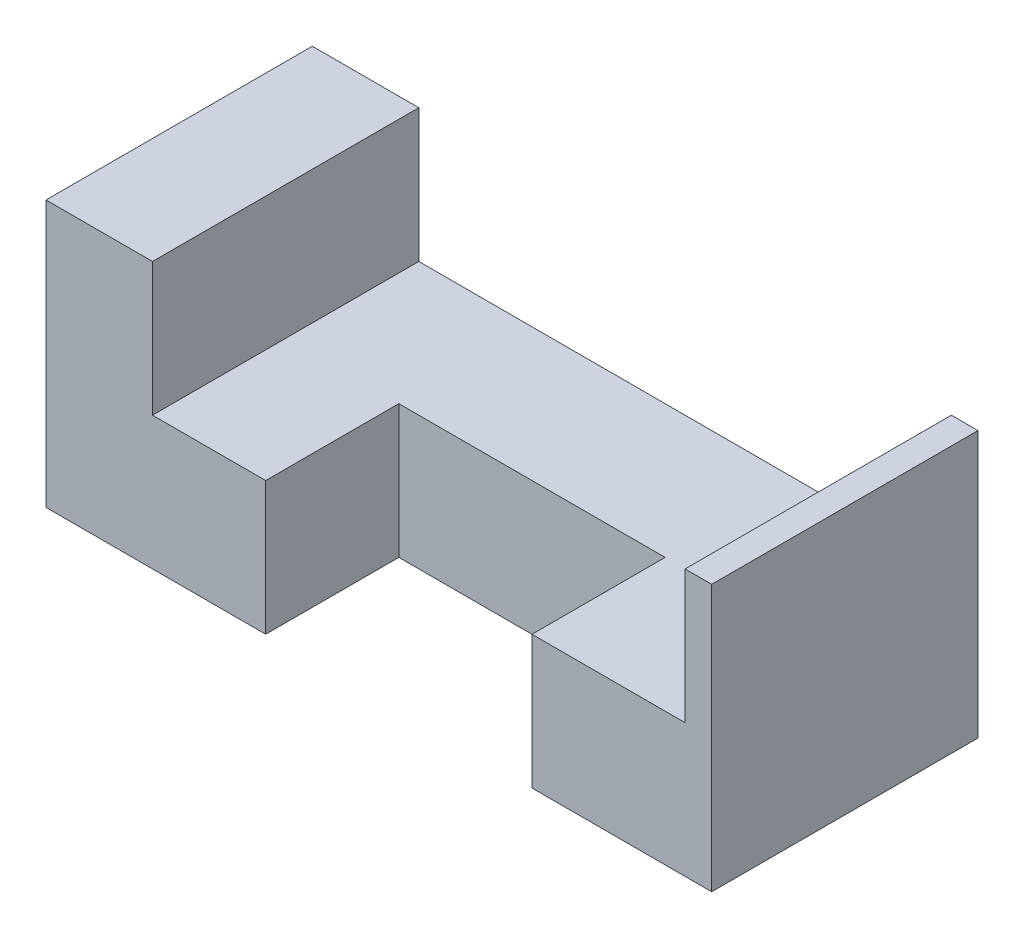
ISO-10303-21;
HEADER;
FILE_DESCRIPTION(('STEP AP214'),'2;1');
FILE_NAME('part.step','',(''),(''),'','','');
FILE_SCHEMA(('AUTOMOTIVE_DESIGN { 1 0 10303 214 1 1 1 1 }'));
ENDSEC;
DATA;
#1=APPLICATION_CONTEXT('core data for automotive mechanical design processes');
#2=APPLICATION_PROTOCOL_DEFINITION('international standard','automotive_design',2000,#1);
#3=PRODUCT_CONTEXT('',#1,'mechanical');
#4=PRODUCT('Part','Part','',(#3));
#5=PRODUCT_RELATED_PRODUCT_CATEGORY('part','',(#4));
#6=PRODUCT_DEFINITION_FORMATION('','',#4);
#7=PRODUCT_DEFINITION_CONTEXT('part definition',#1,'design');
#8=PRODUCT_DEFINITION('design','',#6,#7);
#9=PRODUCT_DEFINITION_SHAPE('','',#8);
#10=(LENGTH_UNIT() NAMED_UNIT(*) SI_UNIT(.MILLI.,.METRE.));
#11=(NAMED_UNIT(*) PLANE_ANGLE_UNIT() SI_UNIT($,.RADIAN.));
#12=(NAMED_UNIT(*) SI_UNIT($,.STERADIAN.) SOLID_ANGLE_UNIT());
#13=UNCERTAINTY_MEASURE_WITH_UNIT(LENGTH_MEASURE(1.E-05),#10,'distance_accuracy_value','');
#14=(GEOMETRIC_REPRESENTATION_CONTEXT(3) GLOBAL_UNCERTAINTY_ASSIGNED_CONTEXT((#13)) GLOBAL_UNIT_ASSIGNED_CONTEXT((#10,
#11,#12)) REPRESENTATION_CONTEXT('',''));
#15=CARTESIAN_POINT('',(0.,0.,0.));
#16=DIRECTION('',(0.,0.,1.));
#17=DIRECTION('',(1.,0.,0.));
#18=AXIS2_PLACEMENT_3D('',#15,#16,#17);
#19=CARTESIAN_POINT('',(0.,0.,20.));
#20=DIRECTION('',(0.,0.,1.));
#21=DIRECTION('',(1.,0.,0.));
#22=AXIS2_PLACEMENT_3D('',#19,#20,#21);
#23=PLANE('',#22);
#24=DIRECTION('',(0.,1.,0.));
#25=VECTOR('',#24,1.);
#26=CARTESIAN_POINT('',(11.5,-10.,20.));
#27=LINE('',#26,#25);
#28=CARTESIAN_POINT('',(11.5,-10.,20.));
#29=VERTEX_POINT('',#28);
#30=CARTESIAN_POINT('',(11.5,0.,20.));
#31=VERTEX_POINT('',#30);
#32=EDGE_CURVE('E164',#29,#31,#27,.T.);
#33=ORIENTED_EDGE('',*,*,#32,.F.);
#34=DIRECTION('',(1.,0.,0.));
#35=VECTOR('',#34,1.);
#36=CARTESIAN_POINT('',(0.,-10.,20.));
#37=LINE('',#36,#35);
#38=CARTESIAN_POINT('',(25.,-10.,20.));
#39=VERTEX_POINT('',#38);
#40=EDGE_CURVE('E132',#29,#39,#37,.T.);
#41=ORIENTED_EDGE('',*,*,#40,.T.);
#42=DIRECTION('',(0.,-1.,0.));
#43=VECTOR('',#42,1.);
#44=CARTESIAN_POINT('',(25.,0.,20.));
#45=LINE('',#44,#43);
#46=CARTESIAN_POINT('',(25.,10.,20.));
#47=VERTEX_POINT('',#46);
#48=EDGE_CURVE('E153',#47,#39,#45,.T.);
#49=ORIENTED_EDGE('',*,*,#48,.F.);
#50=DIRECTION('',(1.,0.,0.));
#51=VECTOR('',#50,1.);
#52=CARTESIAN_POINT('',(0.,10.,20.));
#53=LINE('',#52,#51);
#54=CARTESIAN_POINT('',(23.,10.,20.));
#55=VERTEX_POINT('',#54);
#56=EDGE_CURVE('E186',#55,#47,#53,.T.);
#57=ORIENTED_EDGE('',*,*,#56,.F.);
#58=DIRECTION('',(0.,-1.,0.));
#59=VECTOR('',#58,1.);
#60=CARTESIAN_POINT('',(23.,0.,20.));
#61=LINE('',#60,#59);
#62=CARTESIAN_POINT('',(23.,0.,20.));
#63=VERTEX_POINT('',#62);
#64=EDGE_CURVE('E226',#55,#63,#61,.T.);
#65=ORIENTED_EDGE('',*,*,#64,.T.);
#66=DIRECTION('',(1.,0.,0.));
#67=VECTOR('',#66,1.);
#68=CARTESIAN_POINT('',(0.,0.,20.));
#69=LINE('',#68,#67);
#70=EDGE_CURVE('E205',#31,#63,#69,.T.);
#71=ORIENTED_EDGE('',*,*,#70,.F.);
#72=EDGE_LOOP('',(#33,#41,#49,#57,#65,#71));
#73=FACE_BOUND('',#72,.T.);
#74=ADVANCED_FACE('F41',(#73),#23,.T.);
#75=CARTESIAN_POINT('',(0.,10.,20.));
#76=DIRECTION('',(0.,1.,0.));
#77=DIRECTION('',(0.,0.,1.));
#78=AXIS2_PLACEMENT_3D('',#75,#76,#77);
#79=PLANE('',#78);
#80=DIRECTION('',(1.,0.,0.));
#81=VECTOR('',#80,1.);
#82=CARTESIAN_POINT('',(0.,10.,0.));
#83=LINE('',#82,#81);
#84=CARTESIAN_POINT('',(23.,10.,0.));
#85=VERTEX_POINT('',#84);
#86=CARTESIAN_POINT('',(25.,10.,0.));
#87=VERTEX_POINT('',#86);
#88=EDGE_CURVE('E160',#85,#87,#83,.T.);
#89=ORIENTED_EDGE('',*,*,#88,.F.);
#90=DIRECTION('',(0.,0.,-1.));
#91=VECTOR('',#90,1.);
#92=CARTESIAN_POINT('',(23.,10.,20.));
#93=LINE('',#92,#91);
#94=EDGE_CURVE('E11',#55,#85,#93,.T.);
#95=ORIENTED_EDGE('',*,*,#94,.F.);
#96=ORIENTED_EDGE('',*,*,#56,.T.);
#97=DIRECTION('',(0.,0.,-1.));
#98=VECTOR('',#97,1.);
#99=CARTESIAN_POINT('',(25.,10.,20.));
#100=LINE('',#99,#98);
#101=EDGE_CURVE('E66',#47,#87,#100,.T.);
#102=ORIENTED_EDGE('',*,*,#101,.T.);
#103=EDGE_LOOP('',(#89,#95,#96,#102));
#104=FACE_BOUND('',#103,.T.);
#105=ADVANCED_FACE('F295',(#104),#79,.T.);
#106=CARTESIAN_POINT('',(23.,0.,20.));
#107=DIRECTION('',(1.,0.,0.));
#108=DIRECTION('',(0.,0.,-1.));
#109=AXIS2_PLACEMENT_3D('',#106,#107,#108);
#110=PLANE('',#109);
#111=DIRECTION('',(0.,-1.,0.));
#112=VECTOR('',#111,1.);
#113=CARTESIAN_POINT('',(23.,0.,0.));
#114=LINE('',#113,#112);
#115=CARTESIAN_POINT('',(23.,0.,0.));
#116=VERTEX_POINT('',#115);
#117=EDGE_CURVE('E163',#85,#116,#114,.T.);
#118=ORIENTED_EDGE('',*,*,#117,.T.);
#119=DIRECTION('',(0.,0.,-1.));
#120=VECTOR('',#119,1.);
#121=CARTESIAN_POINT('',(23.,0.,20.));
#122=LINE('',#121,#120);
#123=EDGE_CURVE('E50',#63,#116,#122,.T.);
#124=ORIENTED_EDGE('',*,*,#123,.F.);
#125=ORIENTED_EDGE('',*,*,#64,.F.);
#126=ORIENTED_EDGE('',*,*,#94,.T.);
#127=EDGE_LOOP('',(#118,#124,#125,#126));
#128=FACE_BOUND('',#127,.T.);
#129=ADVANCED_FACE('F43',(#128),#110,.F.);
#130=CARTESIAN_POINT('',(0.,0.,20.));
#131=DIRECTION('',(0.,1.,0.));
#132=DIRECTION('',(0.,0.,1.));
#133=AXIS2_PLACEMENT_3D('',#130,#131,#132);
#134=PLANE('',#133);
#135=DIRECTION('',(0.,0.,-1.));
#136=VECTOR('',#135,1.);
#137=CARTESIAN_POINT('',(11.5,0.,20.));
#138=LINE('',#137,#136);
#139=CARTESIAN_POINT('',(11.5,0.,10.));
#140=VERTEX_POINT('',#139);
#141=EDGE_CURVE('E251',#31,#140,#138,.T.);
#142=ORIENTED_EDGE('',*,*,#141,.F.);
#143=ORIENTED_EDGE('',*,*,#70,.T.);
#144=ORIENTED_EDGE('',*,*,#123,.T.);
#145=DIRECTION('',(1.,0.,0.));
#146=VECTOR('',#145,1.);
#147=CARTESIAN_POINT('',(0.,0.,0.));
#148=LINE('',#147,#146);
#149=CARTESIAN_POINT('',(-17.,0.,0.));
#150=VERTEX_POINT('',#149);
#151=EDGE_CURVE('E169',#150,#116,#148,.T.);
#152=ORIENTED_EDGE('',*,*,#151,.F.);
#153=DIRECTION('',(0.,0.,-1.));
#154=VECTOR('',#153,1.);
#155=CARTESIAN_POINT('',(-17.,0.,20.));
#156=LINE('',#155,#154);
#157=CARTESIAN_POINT('',(-17.,0.,20.));
#158=VERTEX_POINT('',#157);
#159=EDGE_CURVE('E196',#158,#150,#156,.T.);
#160=ORIENTED_EDGE('',*,*,#159,.F.);
#161=CARTESIAN_POINT('',(-8.5,0.,20.));
#162=VERTEX_POINT('',#161);
#163=EDGE_CURVE('E220',#158,#162,#69,.T.);
#164=ORIENTED_EDGE('',*,*,#163,.T.);
#165=DIRECTION('',(0.,0.,1.));
#166=VECTOR('',#165,1.);
#167=CARTESIAN_POINT('',(-8.5,0.,20.));
#168=LINE('',#167,#166);
#169=CARTESIAN_POINT('',(-8.5,0.,10.));
#170=VERTEX_POINT('',#169);
#171=EDGE_CURVE('E57',#170,#162,#168,.T.);
#172=ORIENTED_EDGE('',*,*,#171,.F.);
#173=DIRECTION('',(-1.,0.,0.));
#174=VECTOR('',#173,1.);
#175=CARTESIAN_POINT('',(11.5,0.,10.));
#176=LINE('',#175,#174);
#177=EDGE_CURVE('E247',#140,#170,#176,.T.);
#178=ORIENTED_EDGE('',*,*,#177,.F.);
#179=EDGE_LOOP('',(#142,#143,#144,#152,#160,#164,#172,#178));
#180=FACE_BOUND('',#179,.T.);
#181=ADVANCED_FACE('F203',(#180),#134,.T.);
#182=CARTESIAN_POINT('',(-17.,0.,20.));
#183=DIRECTION('',(1.,0.,0.));
#184=DIRECTION('',(0.,0.,-1.));
#185=AXIS2_PLACEMENT_3D('',#182,#183,#184);
#186=PLANE('',#185);
#187=DIRECTION('',(0.,-1.,0.));
#188=VECTOR('',#187,1.);
#189=CARTESIAN_POINT('',(-17.,0.,0.));
#190=LINE('',#189,#188);
#191=CARTESIAN_POINT('',(-17.,10.,0.));
#192=VERTEX_POINT('',#191);
#193=EDGE_CURVE('E173',#192,#150,#190,.T.);
#194=ORIENTED_EDGE('',*,*,#193,.F.);
#195=DIRECTION('',(0.,0.,-1.));
#196=VECTOR('',#195,1.);
#197=CARTESIAN_POINT('',(-17.,10.,20.));
#198=LINE('',#197,#196);
#199=CARTESIAN_POINT('',(-17.,10.,20.));
#200=VERTEX_POINT('',#199);
#201=EDGE_CURVE('E193',#200,#192,#198,.T.);
#202=ORIENTED_EDGE('',*,*,#201,.F.);
#203=DIRECTION('',(0.,-1.,0.));
#204=VECTOR('',#203,1.);
#205=CARTESIAN_POINT('',(-17.,0.,20.));
#206=LINE('',#205,#204);
#207=EDGE_CURVE('E217',#200,#158,#206,.T.);
#208=ORIENTED_EDGE('',*,*,#207,.T.);
#209=ORIENTED_EDGE('',*,*,#159,.T.);
#210=EDGE_LOOP('',(#194,#202,#208,#209));
#211=FACE_BOUND('',#210,.T.);
#212=ADVANCED_FACE('F215',(#211),#186,.T.);
#213=CARTESIAN_POINT('',(-25.,10.,0.));
#214=VERTEX_POINT('',#213);
#215=EDGE_CURVE('E165',#214,#192,#83,.T.);
#216=ORIENTED_EDGE('',*,*,#215,.F.);
#217=DIRECTION('',(0.,0.,-1.));
#218=VECTOR('',#217,1.);
#219=CARTESIAN_POINT('',(-25.,10.,20.));
#220=LINE('',#219,#218);
#221=CARTESIAN_POINT('',(-25.,10.,20.));
#222=VERTEX_POINT('',#221);
#223=EDGE_CURVE('E143',#222,#214,#220,.T.);
#224=ORIENTED_EDGE('',*,*,#223,.F.);
#225=EDGE_CURVE('E129',#222,#200,#53,.T.);
#226=ORIENTED_EDGE('',*,*,#225,.T.);
#227=ORIENTED_EDGE('',*,*,#201,.T.);
#228=EDGE_LOOP('',(#216,#224,#226,#227));
#229=FACE_BOUND('',#228,.T.);
#230=ADVANCED_FACE('F301',(#229),#79,.T.);
#231=CARTESIAN_POINT('',(-25.,0.,20.));
#232=DIRECTION('',(1.,0.,0.));
#233=DIRECTION('',(0.,0.,-1.));
#234=AXIS2_PLACEMENT_3D('',#231,#232,#233);
#235=PLANE('',#234);
#236=DIRECTION('',(0.,-1.,0.));
#237=VECTOR('',#236,1.);
#238=CARTESIAN_POINT('',(-25.,0.,0.));
#239=LINE('',#238,#237);
#240=CARTESIAN_POINT('',(-25.,-10.,0.));
#241=VERTEX_POINT('',#240);
#242=EDGE_CURVE('E138',#214,#241,#239,.T.);
#243=ORIENTED_EDGE('',*,*,#242,.T.);
#244=DIRECTION('',(0.,0.,-1.));
#245=VECTOR('',#244,1.);
#246=CARTESIAN_POINT('',(-25.,-10.,20.));
#247=LINE('',#246,#245);
#248=CARTESIAN_POINT('',(-25.,-10.,20.));
#249=VERTEX_POINT('',#248);
#250=EDGE_CURVE('E135',#249,#241,#247,.T.);
#251=ORIENTED_EDGE('',*,*,#250,.F.);
#252=DIRECTION('',(0.,-1.,0.));
#253=VECTOR('',#252,1.);
#254=CARTESIAN_POINT('',(-25.,0.,20.));
#255=LINE('',#254,#253);
#256=EDGE_CURVE('E121',#222,#249,#255,.T.);
#257=ORIENTED_EDGE('',*,*,#256,.F.);
#258=ORIENTED_EDGE('',*,*,#223,.T.);
#259=EDGE_LOOP('',(#243,#251,#257,#258));
#260=FACE_BOUND('',#259,.T.);
#261=ADVANCED_FACE('F136',(#260),#235,.F.);
#262=CARTESIAN_POINT('',(0.,-10.,20.));
#263=DIRECTION('',(0.,1.,0.));
#264=DIRECTION('',(0.,0.,1.));
#265=AXIS2_PLACEMENT_3D('',#262,#263,#264);
#266=PLANE('',#265);
#267=ORIENTED_EDGE('',*,*,#40,.F.);
#268=DIRECTION('',(0.,0.,-1.));
#269=VECTOR('',#268,1.);
#270=CARTESIAN_POINT('',(11.5,-10.,20.));
#271=LINE('',#270,#269);
#272=CARTESIAN_POINT('',(11.5,-10.,10.));
#273=VERTEX_POINT('',#272);
#274=EDGE_CURVE('E246',#29,#273,#271,.T.);
#275=ORIENTED_EDGE('',*,*,#274,.T.);
#276=DIRECTION('',(-1.,0.,0.));
#277=VECTOR('',#276,1.);
#278=CARTESIAN_POINT('',(11.5,-10.,10.));
#279=LINE('',#278,#277);
#280=CARTESIAN_POINT('',(-8.5,-10.,10.));
#281=VERTEX_POINT('',#280);
#282=EDGE_CURVE('E257',#273,#281,#279,.T.);
#283=ORIENTED_EDGE('',*,*,#282,.T.);
#284=DIRECTION('',(0.,0.,1.));
#285=VECTOR('',#284,1.);
#286=CARTESIAN_POINT('',(-8.5,-10.,20.));
#287=LINE('',#286,#285);
#288=CARTESIAN_POINT('',(-8.5,-10.,20.));
#289=VERTEX_POINT('',#288);
#290=EDGE_CURVE('E151',#281,#289,#287,.T.);
#291=ORIENTED_EDGE('',*,*,#290,.T.);
#292=EDGE_CURVE('E126',#249,#289,#37,.T.);
#293=ORIENTED_EDGE('',*,*,#292,.F.);
#294=ORIENTED_EDGE('',*,*,#250,.T.);
#295=DIRECTION('',(1.,0.,0.));
#296=VECTOR('',#295,1.);
#297=CARTESIAN_POINT('',(0.,-10.,0.));
#298=LINE('',#297,#296);
#299=CARTESIAN_POINT('',(25.,-10.,0.));
#300=VERTEX_POINT('',#299);
#301=EDGE_CURVE('E179',#241,#300,#298,.T.);
#302=ORIENTED_EDGE('',*,*,#301,.T.);
#303=DIRECTION('',(0.,0.,-1.));
#304=VECTOR('',#303,1.);
#305=CARTESIAN_POINT('',(25.,-10.,20.));
#306=LINE('',#305,#304);
#307=EDGE_CURVE('E144',#39,#300,#306,.T.);
#308=ORIENTED_EDGE('',*,*,#307,.F.);
#309=EDGE_LOOP('',(#267,#275,#283,#291,#293,#294,#302,#308));
#310=FACE_BOUND('',#309,.T.);
#311=ADVANCED_FACE('F148',(#310),#266,.F.);
#312=CARTESIAN_POINT('',(25.,0.,20.));
#313=DIRECTION('',(1.,0.,0.));
#314=DIRECTION('',(0.,0.,-1.));
#315=AXIS2_PLACEMENT_3D('',#312,#313,#314);
#316=PLANE('',#315);
#317=DIRECTION('',(0.,-1.,0.));
#318=VECTOR('',#317,1.);
#319=CARTESIAN_POINT('',(25.,0.,0.));
#320=LINE('',#319,#318);
#321=EDGE_CURVE('E182',#87,#300,#320,.T.);
#322=ORIENTED_EDGE('',*,*,#321,.F.);
#323=ORIENTED_EDGE('',*,*,#101,.F.);
#324=ORIENTED_EDGE('',*,*,#48,.T.);
#325=ORIENTED_EDGE('',*,*,#307,.T.);
#326=EDGE_LOOP('',(#322,#323,#324,#325));
#327=FACE_BOUND('',#326,.T.);
#328=ADVANCED_FACE('F304',(#327),#316,.T.);
#329=DIRECTION('',(0.,1.,0.));
#330=VECTOR('',#329,1.);
#331=CARTESIAN_POINT('',(-8.5,-10.,20.));
#332=LINE('',#331,#330);
#333=EDGE_CURVE('E221',#289,#162,#332,.T.);
#334=ORIENTED_EDGE('',*,*,#333,.T.);
#335=ORIENTED_EDGE('',*,*,#163,.F.);
#336=ORIENTED_EDGE('',*,*,#207,.F.);
#337=ORIENTED_EDGE('',*,*,#225,.F.);
#338=ORIENTED_EDGE('',*,*,#256,.T.);
#339=ORIENTED_EDGE('',*,*,#292,.T.);
#340=EDGE_LOOP('',(#334,#335,#336,#337,#338,#339));
#341=FACE_BOUND('',#340,.T.);
#342=ADVANCED_FACE('F123',(#341),#23,.T.);
#343=CARTESIAN_POINT('',(0.,0.,0.));
#344=DIRECTION('',(0.,0.,1.));
#345=DIRECTION('',(1.,0.,0.));
#346=AXIS2_PLACEMENT_3D('',#343,#344,#345);
#347=PLANE('',#346);
#348=ORIENTED_EDGE('',*,*,#88,.T.);
#349=ORIENTED_EDGE('',*,*,#321,.T.);
#350=ORIENTED_EDGE('',*,*,#301,.F.);
#351=ORIENTED_EDGE('',*,*,#242,.F.);
#352=ORIENTED_EDGE('',*,*,#215,.T.);
#353=ORIENTED_EDGE('',*,*,#193,.T.);
#354=ORIENTED_EDGE('',*,*,#151,.T.);
#355=ORIENTED_EDGE('',*,*,#117,.F.);
#356=EDGE_LOOP('',(#348,#349,#350,#351,#352,#353,#354,#355));
#357=FACE_BOUND('',#356,.T.);
#358=ADVANCED_FACE('F210',(#357),#347,.F.);
#359=CARTESIAN_POINT('',(11.5,-10.,20.));
#360=DIRECTION('',(1.,0.,0.));
#361=DIRECTION('',(0.,0.,-1.));
#362=AXIS2_PLACEMENT_3D('',#359,#360,#361);
#363=PLANE('',#362);
#364=ORIENTED_EDGE('',*,*,#141,.T.);
#365=DIRECTION('',(0.,1.,0.));
#366=VECTOR('',#365,1.);
#367=CARTESIAN_POINT('',(11.5,-10.,10.));
#368=LINE('',#367,#366);
#369=EDGE_CURVE('E232',#273,#140,#368,.T.);
#370=ORIENTED_EDGE('',*,*,#369,.F.);
#371=ORIENTED_EDGE('',*,*,#274,.F.);
#372=ORIENTED_EDGE('',*,*,#32,.T.);
#373=EDGE_LOOP('',(#364,#370,#371,#372));
#374=FACE_BOUND('',#373,.T.);
#375=ADVANCED_FACE('F271',(#374),#363,.F.);
#376=CARTESIAN_POINT('',(-8.5,-10.,20.));
#377=DIRECTION('',(-1.,0.,0.));
#378=DIRECTION('',(0.,0.,1.));
#379=AXIS2_PLACEMENT_3D('',#376,#377,#378);
#380=PLANE('',#379);
#381=ORIENTED_EDGE('',*,*,#171,.T.);
#382=ORIENTED_EDGE('',*,*,#333,.F.);
#383=ORIENTED_EDGE('',*,*,#290,.F.);
#384=DIRECTION('',(0.,1.,0.));
#385=VECTOR('',#384,1.);
#386=CARTESIAN_POINT('',(-8.5,-10.,10.));
#387=LINE('',#386,#385);
#388=EDGE_CURVE('E236',#281,#170,#387,.T.);
#389=ORIENTED_EDGE('',*,*,#388,.T.);
#390=EDGE_LOOP('',(#381,#382,#383,#389));
#391=FACE_BOUND('',#390,.T.);
#392=ADVANCED_FACE('F285',(#391),#380,.F.);
#393=CARTESIAN_POINT('',(11.5,-10.,10.));
#394=DIRECTION('',(0.,0.,-1.));
#395=DIRECTION('',(-1.,0.,0.));
#396=AXIS2_PLACEMENT_3D('',#393,#394,#395);
#397=PLANE('',#396);
#398=ORIENTED_EDGE('',*,*,#177,.T.);
#399=ORIENTED_EDGE('',*,*,#388,.F.);
#400=ORIENTED_EDGE('',*,*,#282,.F.);
#401=ORIENTED_EDGE('',*,*,#369,.T.);
#402=EDGE_LOOP('',(#398,#399,#400,#401));
#403=FACE_BOUND('',#402,.T.);
#404=ADVANCED_FACE('F283',(#403),#397,.F.);
#405=CLOSED_SHELL('',(#74,#105,#129,#181,#212,#230,#261,#311,#328,#342,#358,#375,#392,#404));
#406=MANIFOLD_SOLID_BREP('B2',#405);
#407=ADVANCED_BREP_SHAPE_REPRESENTATION('',(#18,#406),#14);
#408=SHAPE_DEFINITION_REPRESENTATION(#9,#407);
ENDSEC;
END-ISO-10303-21;
